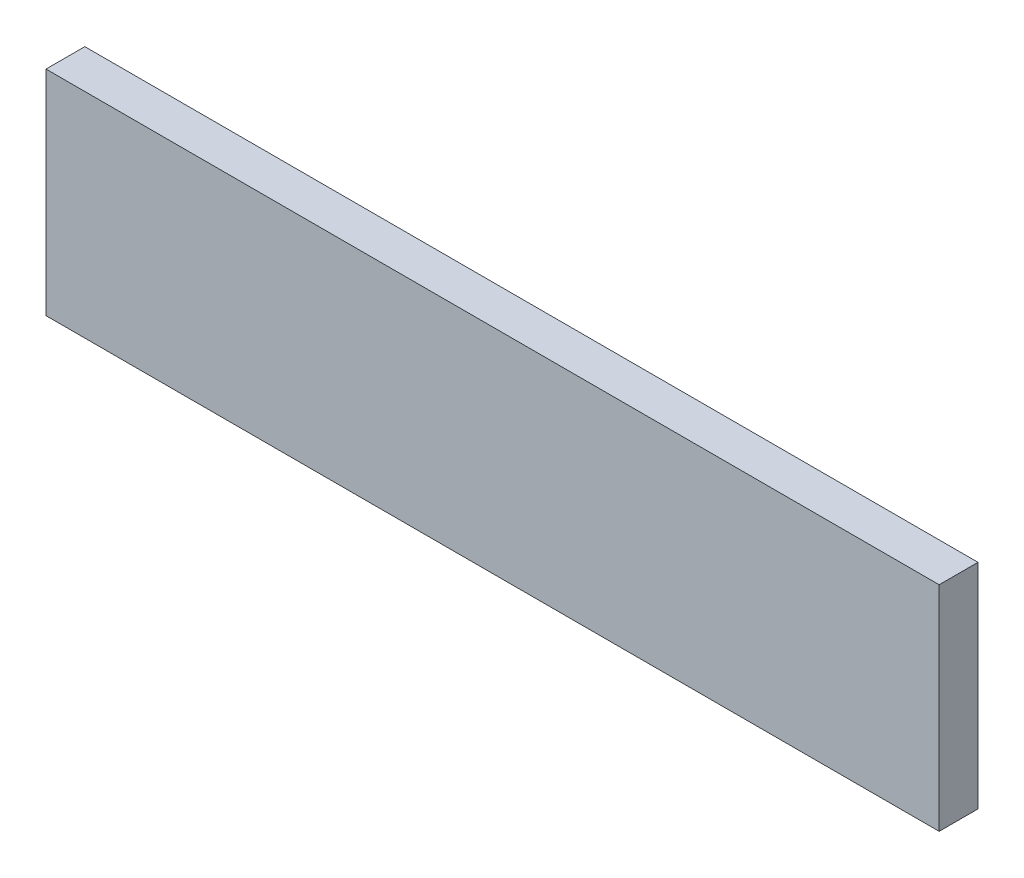
ISO-10303-21;
HEADER;
FILE_DESCRIPTION(('STEP AP214'),'2;1');
FILE_NAME('part.step','',(''),(''),'','','');
FILE_SCHEMA(('AUTOMOTIVE_DESIGN { 1 0 10303 214 1 1 1 1 }'));
ENDSEC;
DATA;
#1=APPLICATION_CONTEXT('core data for automotive mechanical design processes');
#2=APPLICATION_PROTOCOL_DEFINITION('international standard','automotive_design',2000,#1);
#3=PRODUCT_CONTEXT('',#1,'mechanical');
#4=PRODUCT('Part','Part','',(#3));
#5=PRODUCT_RELATED_PRODUCT_CATEGORY('part','',(#4));
#6=PRODUCT_DEFINITION_FORMATION('','',#4);
#7=PRODUCT_DEFINITION_CONTEXT('part definition',#1,'design');
#8=PRODUCT_DEFINITION('design','',#6,#7);
#9=PRODUCT_DEFINITION_SHAPE('','',#8);
#10=(LENGTH_UNIT() NAMED_UNIT(*) SI_UNIT(.MILLI.,.METRE.));
#11=(NAMED_UNIT(*) PLANE_ANGLE_UNIT() SI_UNIT($,.RADIAN.));
#12=(NAMED_UNIT(*) SI_UNIT($,.STERADIAN.) SOLID_ANGLE_UNIT());
#13=UNCERTAINTY_MEASURE_WITH_UNIT(LENGTH_MEASURE(1.E-05),#10,'distance_accuracy_value','');
#14=(GEOMETRIC_REPRESENTATION_CONTEXT(3) GLOBAL_UNCERTAINTY_ASSIGNED_CONTEXT((#13)) GLOBAL_UNIT_ASSIGNED_CONTEXT((#10,
#11,#12)) REPRESENTATION_CONTEXT('',''));
#15=CARTESIAN_POINT('',(0.,0.,0.));
#16=DIRECTION('',(0.,0.,1.));
#17=DIRECTION('',(1.,0.,0.));
#18=AXIS2_PLACEMENT_3D('',#15,#16,#17);
#19=CARTESIAN_POINT('',(73.025,-17.4625,3.175));
#20=DIRECTION('',(-1.,0.,0.));
#21=DIRECTION('',(0.,0.,1.));
#22=AXIS2_PLACEMENT_3D('',#19,#20,#21);
#23=PLANE('',#22);
#24=DIRECTION('',(0.,1.,0.));
#25=VECTOR('',#24,1.);
#26=CARTESIAN_POINT('',(73.025,-17.4625,-3.175));
#27=LINE('',#26,#25);
#28=CARTESIAN_POINT('',(73.025,-17.4625,-3.175));
#29=VERTEX_POINT('',#28);
#30=CARTESIAN_POINT('',(73.025,17.4625,-3.175));
#31=VERTEX_POINT('',#30);
#32=EDGE_CURVE('E96',#29,#31,#27,.T.);
#33=ORIENTED_EDGE('',*,*,#32,.T.);
#34=DIRECTION('',(0.,0.,-1.));
#35=VECTOR('',#34,1.);
#36=CARTESIAN_POINT('',(73.025,17.4625,3.175));
#37=LINE('',#36,#35);
#38=CARTESIAN_POINT('',(73.025,17.4625,3.175));
#39=VERTEX_POINT('',#38);
#40=EDGE_CURVE('E11',#39,#31,#37,.T.);
#41=ORIENTED_EDGE('',*,*,#40,.F.);
#42=DIRECTION('',(0.,1.,0.));
#43=VECTOR('',#42,1.);
#44=CARTESIAN_POINT('',(73.025,-17.4625,3.175));
#45=LINE('',#44,#43);
#46=CARTESIAN_POINT('',(73.025,-17.4625,3.175));
#47=VERTEX_POINT('',#46);
#48=EDGE_CURVE('E84',#47,#39,#45,.T.);
#49=ORIENTED_EDGE('',*,*,#48,.F.);
#50=DIRECTION('',(0.,0.,-1.));
#51=VECTOR('',#50,1.);
#52=CARTESIAN_POINT('',(73.025,-17.4625,3.175));
#53=LINE('',#52,#51);
#54=EDGE_CURVE('E92',#47,#29,#53,.T.);
#55=ORIENTED_EDGE('',*,*,#54,.T.);
#56=EDGE_LOOP('',(#33,#41,#49,#55));
#57=FACE_BOUND('',#56,.T.);
#58=ADVANCED_FACE('F33',(#57),#23,.F.);
#59=CARTESIAN_POINT('',(-73.025,17.4625,3.175));
#60=DIRECTION('',(0.,-1.,0.));
#61=DIRECTION('',(0.,0.,-1.));
#62=AXIS2_PLACEMENT_3D('',#59,#60,#61);
#63=PLANE('',#62);
#64=DIRECTION('',(-1.,0.,0.));
#65=VECTOR('',#64,1.);
#66=CARTESIAN_POINT('',(-73.025,17.4625,-3.175));
#67=LINE('',#66,#65);
#68=CARTESIAN_POINT('',(-73.025,17.4625,-3.175));
#69=VERTEX_POINT('',#68);
#70=EDGE_CURVE('E88',#31,#69,#67,.T.);
#71=ORIENTED_EDGE('',*,*,#70,.T.);
#72=DIRECTION('',(0.,0.,-1.));
#73=VECTOR('',#72,1.);
#74=CARTESIAN_POINT('',(-73.025,17.4625,3.175));
#75=LINE('',#74,#73);
#76=CARTESIAN_POINT('',(-73.025,17.4625,3.175));
#77=VERTEX_POINT('',#76);
#78=EDGE_CURVE('E41',#77,#69,#75,.T.);
#79=ORIENTED_EDGE('',*,*,#78,.F.);
#80=DIRECTION('',(-1.,0.,0.));
#81=VECTOR('',#80,1.);
#82=CARTESIAN_POINT('',(-73.025,17.4625,3.175));
#83=LINE('',#82,#81);
#84=EDGE_CURVE('E79',#39,#77,#83,.T.);
#85=ORIENTED_EDGE('',*,*,#84,.F.);
#86=ORIENTED_EDGE('',*,*,#40,.T.);
#87=EDGE_LOOP('',(#71,#79,#85,#86));
#88=FACE_BOUND('',#87,.T.);
#89=ADVANCED_FACE('F87',(#88),#63,.F.);
#90=CARTESIAN_POINT('',(-73.025,-17.4625,3.175));
#91=DIRECTION('',(1.,0.,0.));
#92=DIRECTION('',(0.,0.,-1.));
#93=AXIS2_PLACEMENT_3D('',#90,#91,#92);
#94=PLANE('',#93);
#95=DIRECTION('',(0.,-1.,0.));
#96=VECTOR('',#95,1.);
#97=CARTESIAN_POINT('',(-73.025,-17.4625,-3.175));
#98=LINE('',#97,#96);
#99=CARTESIAN_POINT('',(-73.025,-17.4625,-3.175));
#100=VERTEX_POINT('',#99);
#101=EDGE_CURVE('E66',#69,#100,#98,.T.);
#102=ORIENTED_EDGE('',*,*,#101,.T.);
#103=DIRECTION('',(0.,0.,-1.));
#104=VECTOR('',#103,1.);
#105=CARTESIAN_POINT('',(-73.025,-17.4625,3.175));
#106=LINE('',#105,#104);
#107=CARTESIAN_POINT('',(-73.025,-17.4625,3.175));
#108=VERTEX_POINT('',#107);
#109=EDGE_CURVE('E89',#108,#100,#106,.T.);
#110=ORIENTED_EDGE('',*,*,#109,.F.);
#111=DIRECTION('',(0.,-1.,0.));
#112=VECTOR('',#111,1.);
#113=CARTESIAN_POINT('',(-73.025,-17.4625,3.175));
#114=LINE('',#113,#112);
#115=EDGE_CURVE('E82',#77,#108,#114,.T.);
#116=ORIENTED_EDGE('',*,*,#115,.F.);
#117=ORIENTED_EDGE('',*,*,#78,.T.);
#118=EDGE_LOOP('',(#102,#110,#116,#117));
#119=FACE_BOUND('',#118,.T.);
#120=ADVANCED_FACE('F90',(#119),#94,.F.);
#121=CARTESIAN_POINT('',(-73.025,-17.4625,3.175));
#122=DIRECTION('',(0.,1.,0.));
#123=DIRECTION('',(0.,0.,1.));
#124=AXIS2_PLACEMENT_3D('',#121,#122,#123);
#125=PLANE('',#124);
#126=DIRECTION('',(1.,0.,0.));
#127=VECTOR('',#126,1.);
#128=CARTESIAN_POINT('',(-73.025,-17.4625,-3.175));
#129=LINE('',#128,#127);
#130=EDGE_CURVE('E72',#100,#29,#129,.T.);
#131=ORIENTED_EDGE('',*,*,#130,.T.);
#132=ORIENTED_EDGE('',*,*,#54,.F.);
#133=DIRECTION('',(1.,0.,0.));
#134=VECTOR('',#133,1.);
#135=CARTESIAN_POINT('',(-73.025,-17.4625,3.175));
#136=LINE('',#135,#134);
#137=EDGE_CURVE('E49',#108,#47,#136,.T.);
#138=ORIENTED_EDGE('',*,*,#137,.F.);
#139=ORIENTED_EDGE('',*,*,#109,.T.);
#140=EDGE_LOOP('',(#131,#132,#138,#139));
#141=FACE_BOUND('',#140,.T.);
#142=ADVANCED_FACE('F103',(#141),#125,.F.);
#143=CARTESIAN_POINT('',(0.,0.,3.175));
#144=DIRECTION('',(0.,0.,-1.));
#145=DIRECTION('',(-1.,0.,0.));
#146=AXIS2_PLACEMENT_3D('',#143,#144,#145);
#147=PLANE('',#146);
#148=ORIENTED_EDGE('',*,*,#48,.T.);
#149=ORIENTED_EDGE('',*,*,#84,.T.);
#150=ORIENTED_EDGE('',*,*,#115,.T.);
#151=ORIENTED_EDGE('',*,*,#137,.T.);
#152=EDGE_LOOP('',(#148,#149,#150,#151));
#153=FACE_BOUND('',#152,.T.);
#154=ADVANCED_FACE('F80',(#153),#147,.F.);
#155=CARTESIAN_POINT('',(0.,0.,-3.175));
#156=DIRECTION('',(0.,0.,-1.));
#157=DIRECTION('',(-1.,0.,0.));
#158=AXIS2_PLACEMENT_3D('',#155,#156,#157);
#159=PLANE('',#158);
#160=ORIENTED_EDGE('',*,*,#32,.F.);
#161=ORIENTED_EDGE('',*,*,#130,.F.);
#162=ORIENTED_EDGE('',*,*,#101,.F.);
#163=ORIENTED_EDGE('',*,*,#70,.F.);
#164=EDGE_LOOP('',(#160,#161,#162,#163));
#165=FACE_BOUND('',#164,.T.);
#166=ADVANCED_FACE('F106',(#165),#159,.T.);
#167=CLOSED_SHELL('',(#58,#89,#120,#142,#154,#166));
#168=MANIFOLD_SOLID_BREP('B2',#167);
#169=ADVANCED_BREP_SHAPE_REPRESENTATION('',(#18,#168),#14);
#170=SHAPE_DEFINITION_REPRESENTATION(#9,#169);
ENDSEC;
END-ISO-10303-21;
